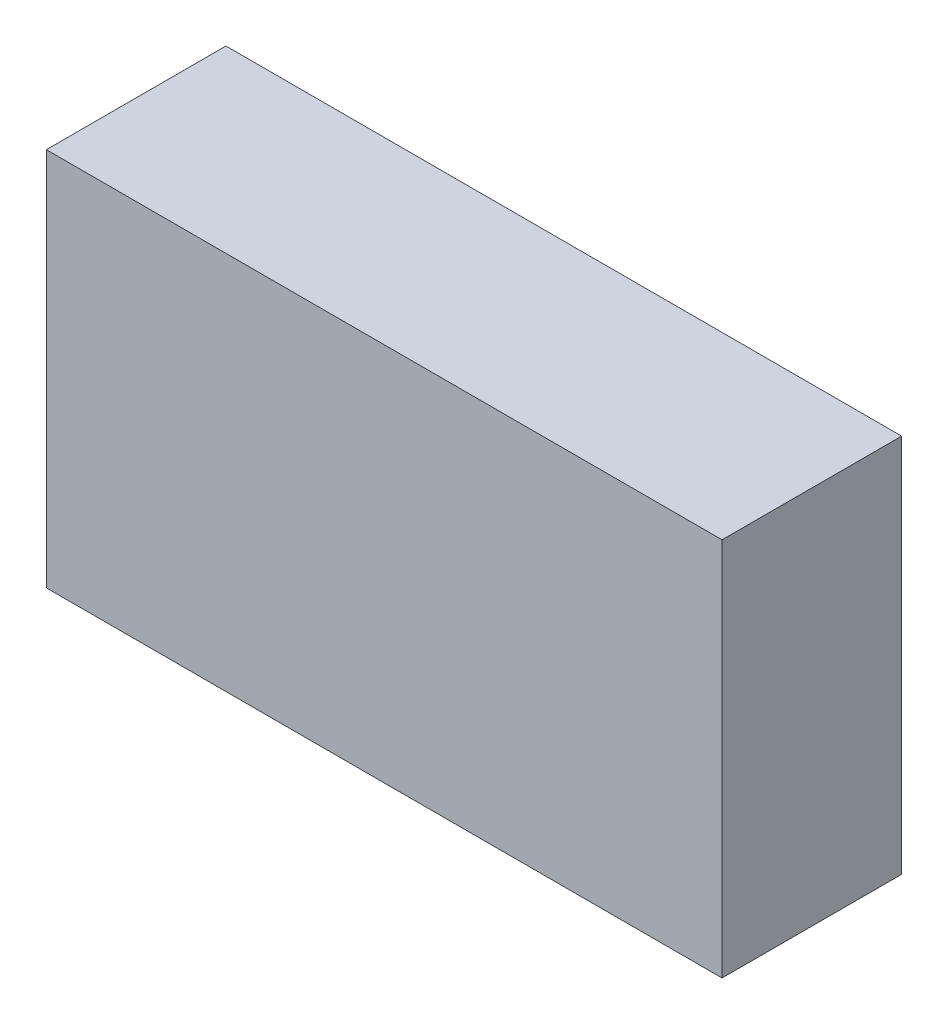
ISO-10303-21;
HEADER;
FILE_DESCRIPTION(('STEP AP214'),'2;1');
FILE_NAME('part.step','',(''),(''),'','','');
FILE_SCHEMA(('AUTOMOTIVE_DESIGN { 1 0 10303 214 1 1 1 1 }'));
ENDSEC;
DATA;
#1=APPLICATION_CONTEXT('core data for automotive mechanical design processes');
#2=APPLICATION_PROTOCOL_DEFINITION('international standard','automotive_design',2000,#1);
#3=PRODUCT_CONTEXT('',#1,'mechanical');
#4=PRODUCT('Part','Part','',(#3));
#5=PRODUCT_RELATED_PRODUCT_CATEGORY('part','',(#4));
#6=PRODUCT_DEFINITION_FORMATION('','',#4);
#7=PRODUCT_DEFINITION_CONTEXT('part definition',#1,'design');
#8=PRODUCT_DEFINITION('design','',#6,#7);
#9=PRODUCT_DEFINITION_SHAPE('','',#8);
#10=(LENGTH_UNIT() NAMED_UNIT(*) SI_UNIT(.MILLI.,.METRE.));
#11=(NAMED_UNIT(*) PLANE_ANGLE_UNIT() SI_UNIT($,.RADIAN.));
#12=(NAMED_UNIT(*) SI_UNIT($,.STERADIAN.) SOLID_ANGLE_UNIT());
#13=UNCERTAINTY_MEASURE_WITH_UNIT(LENGTH_MEASURE(1.E-05),#10,'distance_accuracy_value','');
#14=(GEOMETRIC_REPRESENTATION_CONTEXT(3) GLOBAL_UNCERTAINTY_ASSIGNED_CONTEXT((#13)) GLOBAL_UNIT_ASSIGNED_CONTEXT((#10,
#11,#12)) REPRESENTATION_CONTEXT('',''));
#15=CARTESIAN_POINT('',(0.,0.,0.));
#16=DIRECTION('',(0.,0.,1.));
#17=DIRECTION('',(1.,0.,0.));
#18=AXIS2_PLACEMENT_3D('',#15,#16,#17);
#19=CARTESIAN_POINT('',(0.,0.,9.7));
#20=DIRECTION('',(1.,0.,0.));
#21=DIRECTION('',(0.,0.,-1.));
#22=AXIS2_PLACEMENT_3D('',#19,#20,#21);
#23=PLANE('',#22);
#24=DIRECTION('',(0.,-1.,0.));
#25=VECTOR('',#24,1.);
#26=CARTESIAN_POINT('',(0.,0.,0.));
#27=LINE('',#26,#25);
#28=CARTESIAN_POINT('',(0.,20.5,0.));
#29=VERTEX_POINT('',#28);
#30=CARTESIAN_POINT('',(0.,0.,0.));
#31=VERTEX_POINT('',#30);
#32=EDGE_CURVE('E107',#29,#31,#27,.T.);
#33=ORIENTED_EDGE('',*,*,#32,.T.);
#34=DIRECTION('',(0.,0.,-1.));
#35=VECTOR('',#34,1.);
#36=CARTESIAN_POINT('',(0.,0.,9.7));
#37=LINE('',#36,#35);
#38=CARTESIAN_POINT('',(0.,0.,9.7));
#39=VERTEX_POINT('',#38);
#40=EDGE_CURVE('E11',#39,#31,#37,.T.);
#41=ORIENTED_EDGE('',*,*,#40,.F.);
#42=DIRECTION('',(0.,-1.,0.));
#43=VECTOR('',#42,1.);
#44=CARTESIAN_POINT('',(0.,0.,9.7));
#45=LINE('',#44,#43);
#46=CARTESIAN_POINT('',(0.,20.5,9.7));
#47=VERTEX_POINT('',#46);
#48=EDGE_CURVE('E91',#47,#39,#45,.T.);
#49=ORIENTED_EDGE('',*,*,#48,.F.);
#50=DIRECTION('',(0.,0.,-1.));
#51=VECTOR('',#50,1.);
#52=CARTESIAN_POINT('',(0.,20.5,9.7));
#53=LINE('',#52,#51);
#54=EDGE_CURVE('E103',#47,#29,#53,.T.);
#55=ORIENTED_EDGE('',*,*,#54,.T.);
#56=EDGE_LOOP('',(#33,#41,#49,#55));
#57=FACE_BOUND('',#56,.T.);
#58=ADVANCED_FACE('F39',(#57),#23,.F.);
#59=CARTESIAN_POINT('',(0.,0.,9.7));
#60=DIRECTION('',(0.,1.,0.));
#61=DIRECTION('',(0.,0.,1.));
#62=AXIS2_PLACEMENT_3D('',#59,#60,#61);
#63=PLANE('',#62);
#64=DIRECTION('',(1.,0.,0.));
#65=VECTOR('',#64,1.);
#66=CARTESIAN_POINT('',(0.,0.,0.));
#67=LINE('',#66,#65);
#68=CARTESIAN_POINT('',(36.5,0.,0.));
#69=VERTEX_POINT('',#68);
#70=EDGE_CURVE('E96',#31,#69,#67,.T.);
#71=ORIENTED_EDGE('',*,*,#70,.T.);
#72=DIRECTION('',(0.,0.,-1.));
#73=VECTOR('',#72,1.);
#74=CARTESIAN_POINT('',(36.5,0.,9.7));
#75=LINE('',#74,#73);
#76=CARTESIAN_POINT('',(36.5,0.,9.7));
#77=VERTEX_POINT('',#76);
#78=EDGE_CURVE('E48',#77,#69,#75,.T.);
#79=ORIENTED_EDGE('',*,*,#78,.F.);
#80=DIRECTION('',(1.,0.,0.));
#81=VECTOR('',#80,1.);
#82=CARTESIAN_POINT('',(0.,0.,9.7));
#83=LINE('',#82,#81);
#84=EDGE_CURVE('E86',#39,#77,#83,.T.);
#85=ORIENTED_EDGE('',*,*,#84,.F.);
#86=ORIENTED_EDGE('',*,*,#40,.T.);
#87=EDGE_LOOP('',(#71,#79,#85,#86));
#88=FACE_BOUND('',#87,.T.);
#89=ADVANCED_FACE('F95',(#88),#63,.F.);
#90=CARTESIAN_POINT('',(36.5,0.,9.7));
#91=DIRECTION('',(-1.,0.,0.));
#92=DIRECTION('',(0.,0.,1.));
#93=AXIS2_PLACEMENT_3D('',#90,#91,#92);
#94=PLANE('',#93);
#95=DIRECTION('',(0.,1.,0.));
#96=VECTOR('',#95,1.);
#97=CARTESIAN_POINT('',(36.5,0.,0.));
#98=LINE('',#97,#96);
#99=CARTESIAN_POINT('',(36.5,20.5,0.));
#100=VERTEX_POINT('',#99);
#101=EDGE_CURVE('E73',#69,#100,#98,.T.);
#102=ORIENTED_EDGE('',*,*,#101,.T.);
#103=DIRECTION('',(0.,0.,-1.));
#104=VECTOR('',#103,1.);
#105=CARTESIAN_POINT('',(36.5,20.5,9.7));
#106=LINE('',#105,#104);
#107=CARTESIAN_POINT('',(36.5,20.5,9.7));
#108=VERTEX_POINT('',#107);
#109=EDGE_CURVE('E98',#108,#100,#106,.T.);
#110=ORIENTED_EDGE('',*,*,#109,.F.);
#111=DIRECTION('',(0.,1.,0.));
#112=VECTOR('',#111,1.);
#113=CARTESIAN_POINT('',(36.5,0.,9.7));
#114=LINE('',#113,#112);
#115=EDGE_CURVE('E89',#77,#108,#114,.T.);
#116=ORIENTED_EDGE('',*,*,#115,.F.);
#117=ORIENTED_EDGE('',*,*,#78,.T.);
#118=EDGE_LOOP('',(#102,#110,#116,#117));
#119=FACE_BOUND('',#118,.T.);
#120=ADVANCED_FACE('F99',(#119),#94,.F.);
#121=CARTESIAN_POINT('',(0.,20.5,9.7));
#122=DIRECTION('',(0.,-1.,0.));
#123=DIRECTION('',(0.,0.,-1.));
#124=AXIS2_PLACEMENT_3D('',#121,#122,#123);
#125=PLANE('',#124);
#126=DIRECTION('',(-1.,0.,0.));
#127=VECTOR('',#126,1.);
#128=CARTESIAN_POINT('',(0.,20.5,0.));
#129=LINE('',#128,#127);
#130=EDGE_CURVE('E79',#100,#29,#129,.T.);
#131=ORIENTED_EDGE('',*,*,#130,.T.);
#132=ORIENTED_EDGE('',*,*,#54,.F.);
#133=DIRECTION('',(-1.,0.,0.));
#134=VECTOR('',#133,1.);
#135=CARTESIAN_POINT('',(0.,20.5,9.7));
#136=LINE('',#135,#134);
#137=EDGE_CURVE('E56',#108,#47,#136,.T.);
#138=ORIENTED_EDGE('',*,*,#137,.F.);
#139=ORIENTED_EDGE('',*,*,#109,.T.);
#140=EDGE_LOOP('',(#131,#132,#138,#139));
#141=FACE_BOUND('',#140,.T.);
#142=ADVANCED_FACE('F120',(#141),#125,.F.);
#143=CARTESIAN_POINT('',(0.,0.,9.7));
#144=DIRECTION('',(0.,0.,-1.));
#145=DIRECTION('',(-1.,0.,0.));
#146=AXIS2_PLACEMENT_3D('',#143,#144,#145);
#147=PLANE('',#146);
#148=ORIENTED_EDGE('',*,*,#48,.T.);
#149=ORIENTED_EDGE('',*,*,#84,.T.);
#150=ORIENTED_EDGE('',*,*,#115,.T.);
#151=ORIENTED_EDGE('',*,*,#137,.T.);
#152=EDGE_LOOP('',(#148,#149,#150,#151));
#153=FACE_BOUND('',#152,.T.);
#154=ADVANCED_FACE('F87',(#153),#147,.F.);
#155=CARTESIAN_POINT('',(0.,0.,0.));
#156=DIRECTION('',(0.,0.,-1.));
#157=DIRECTION('',(-1.,0.,0.));
#158=AXIS2_PLACEMENT_3D('',#155,#156,#157);
#159=PLANE('',#158);
#160=ORIENTED_EDGE('',*,*,#32,.F.);
#161=ORIENTED_EDGE('',*,*,#130,.F.);
#162=ORIENTED_EDGE('',*,*,#101,.F.);
#163=ORIENTED_EDGE('',*,*,#70,.F.);
#164=EDGE_LOOP('',(#160,#161,#162,#163));
#165=FACE_BOUND('',#164,.T.);
#166=ADVANCED_FACE('F123',(#165),#159,.T.);
#167=CLOSED_SHELL('',(#58,#89,#120,#142,#154,#166));
#168=MANIFOLD_SOLID_BREP('B2',#167);
#169=ADVANCED_BREP_SHAPE_REPRESENTATION('',(#18,#168),#14);
#170=SHAPE_DEFINITION_REPRESENTATION(#9,#169);
ENDSEC;
END-ISO-10303-21;
